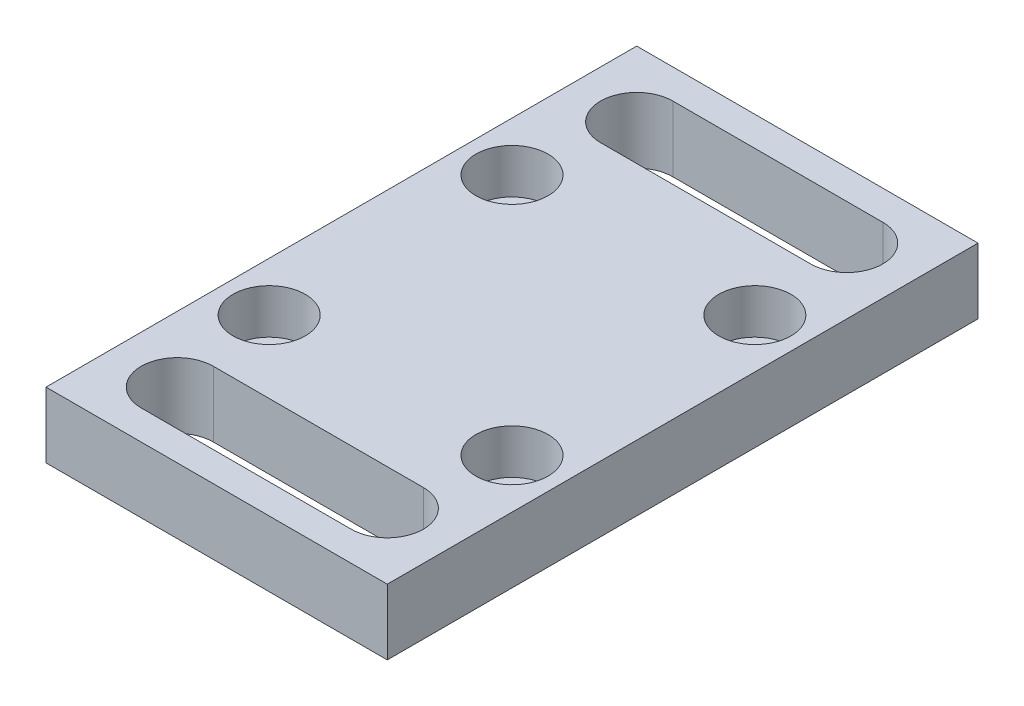
ISO-10303-21;
HEADER;
FILE_DESCRIPTION(('STEP AP214'),'2;1');
FILE_NAME('part.step','',(''),(''),'','','');
FILE_SCHEMA(('AUTOMOTIVE_DESIGN { 1 0 10303 214 1 1 1 1 }'));
ENDSEC;
DATA;
#1=APPLICATION_CONTEXT('core data for automotive mechanical design processes');
#2=APPLICATION_PROTOCOL_DEFINITION('international standard','automotive_design',2000,#1);
#3=PRODUCT_CONTEXT('',#1,'mechanical');
#4=PRODUCT('Part','Part','',(#3));
#5=PRODUCT_RELATED_PRODUCT_CATEGORY('part','',(#4));
#6=PRODUCT_DEFINITION_FORMATION('','',#4);
#7=PRODUCT_DEFINITION_CONTEXT('part definition',#1,'design');
#8=PRODUCT_DEFINITION('design','',#6,#7);
#9=PRODUCT_DEFINITION_SHAPE('','',#8);
#10=(LENGTH_UNIT() NAMED_UNIT(*) SI_UNIT(.MILLI.,.METRE.));
#11=(NAMED_UNIT(*) PLANE_ANGLE_UNIT() SI_UNIT($,.RADIAN.));
#12=(NAMED_UNIT(*) SI_UNIT($,.STERADIAN.) SOLID_ANGLE_UNIT());
#13=UNCERTAINTY_MEASURE_WITH_UNIT(LENGTH_MEASURE(1.E-05),#10,'distance_accuracy_value','');
#14=(GEOMETRIC_REPRESENTATION_CONTEXT(3) GLOBAL_UNCERTAINTY_ASSIGNED_CONTEXT((#13)) GLOBAL_UNIT_ASSIGNED_CONTEXT((#10,
#11,#12)) REPRESENTATION_CONTEXT('',''));
#15=CARTESIAN_POINT('',(0.,0.,0.));
#16=DIRECTION('',(0.,0.,1.));
#17=DIRECTION('',(1.,0.,0.));
#18=AXIS2_PLACEMENT_3D('',#15,#16,#17);
#19=CARTESIAN_POINT('',(26.,10.,45.));
#20=DIRECTION('',(-1.,0.,0.));
#21=DIRECTION('',(0.,0.,1.));
#22=AXIS2_PLACEMENT_3D('',#19,#20,#21);
#23=PLANE('',#22);
#24=DIRECTION('',(0.,0.,-1.));
#25=VECTOR('',#24,1.);
#26=CARTESIAN_POINT('',(26.,0.,45.));
#27=LINE('',#26,#25);
#28=CARTESIAN_POINT('',(26.,0.,45.));
#29=VERTEX_POINT('',#28);
#30=CARTESIAN_POINT('',(26.,0.,-45.));
#31=VERTEX_POINT('',#30);
#32=EDGE_CURVE('E221',#29,#31,#27,.T.);
#33=ORIENTED_EDGE('',*,*,#32,.T.);
#34=DIRECTION('',(0.,-1.,0.));
#35=VECTOR('',#34,1.);
#36=CARTESIAN_POINT('',(26.,10.,-45.));
#37=LINE('',#36,#35);
#38=CARTESIAN_POINT('',(26.,10.,-45.));
#39=VERTEX_POINT('',#38);
#40=EDGE_CURVE('E11',#39,#31,#37,.T.);
#41=ORIENTED_EDGE('',*,*,#40,.F.);
#42=DIRECTION('',(0.,0.,-1.));
#43=VECTOR('',#42,1.);
#44=CARTESIAN_POINT('',(26.,10.,45.));
#45=LINE('',#44,#43);
#46=CARTESIAN_POINT('',(26.,10.,45.));
#47=VERTEX_POINT('',#46);
#48=EDGE_CURVE('E222',#47,#39,#45,.T.);
#49=ORIENTED_EDGE('',*,*,#48,.F.);
#50=DIRECTION('',(0.,-1.,0.));
#51=VECTOR('',#50,1.);
#52=CARTESIAN_POINT('',(26.,10.,45.));
#53=LINE('',#52,#51);
#54=EDGE_CURVE('E232',#47,#29,#53,.T.);
#55=ORIENTED_EDGE('',*,*,#54,.T.);
#56=EDGE_LOOP('',(#33,#41,#49,#55));
#57=FACE_BOUND('',#56,.T.);
#58=ADVANCED_FACE('F17',(#57),#23,.F.);
#59=CARTESIAN_POINT('',(-26.,10.,-45.));
#60=DIRECTION('',(0.,0.,1.));
#61=DIRECTION('',(1.,0.,0.));
#62=AXIS2_PLACEMENT_3D('',#59,#60,#61);
#63=PLANE('',#62);
#64=DIRECTION('',(-1.,0.,0.));
#65=VECTOR('',#64,1.);
#66=CARTESIAN_POINT('',(-26.,0.,-45.));
#67=LINE('',#66,#65);
#68=CARTESIAN_POINT('',(-26.,0.,-45.));
#69=VERTEX_POINT('',#68);
#70=EDGE_CURVE('E235',#31,#69,#67,.T.);
#71=ORIENTED_EDGE('',*,*,#70,.T.);
#72=DIRECTION('',(0.,-1.,0.));
#73=VECTOR('',#72,1.);
#74=CARTESIAN_POINT('',(-26.,10.,-45.));
#75=LINE('',#74,#73);
#76=CARTESIAN_POINT('',(-26.,10.,-45.));
#77=VERTEX_POINT('',#76);
#78=EDGE_CURVE('E24',#77,#69,#75,.T.);
#79=ORIENTED_EDGE('',*,*,#78,.F.);
#80=DIRECTION('',(-1.,0.,0.));
#81=VECTOR('',#80,1.);
#82=CARTESIAN_POINT('',(-26.,10.,-45.));
#83=LINE('',#82,#81);
#84=EDGE_CURVE('E225',#39,#77,#83,.T.);
#85=ORIENTED_EDGE('',*,*,#84,.F.);
#86=ORIENTED_EDGE('',*,*,#40,.T.);
#87=EDGE_LOOP('',(#71,#79,#85,#86));
#88=FACE_BOUND('',#87,.T.);
#89=ADVANCED_FACE('F264',(#88),#63,.F.);
#90=CARTESIAN_POINT('',(-26.,10.,45.));
#91=DIRECTION('',(1.,0.,0.));
#92=DIRECTION('',(0.,0.,-1.));
#93=AXIS2_PLACEMENT_3D('',#90,#91,#92);
#94=PLANE('',#93);
#95=DIRECTION('',(0.,0.,1.));
#96=VECTOR('',#95,1.);
#97=CARTESIAN_POINT('',(-26.,0.,45.));
#98=LINE('',#97,#96);
#99=CARTESIAN_POINT('',(-26.,0.,45.));
#100=VERTEX_POINT('',#99);
#101=EDGE_CURVE('E237',#69,#100,#98,.T.);
#102=ORIENTED_EDGE('',*,*,#101,.T.);
#103=DIRECTION('',(0.,-1.,0.));
#104=VECTOR('',#103,1.);
#105=CARTESIAN_POINT('',(-26.,10.,45.));
#106=LINE('',#105,#104);
#107=CARTESIAN_POINT('',(-26.,10.,45.));
#108=VERTEX_POINT('',#107);
#109=EDGE_CURVE('E242',#108,#100,#106,.T.);
#110=ORIENTED_EDGE('',*,*,#109,.F.);
#111=DIRECTION('',(0.,0.,1.));
#112=VECTOR('',#111,1.);
#113=CARTESIAN_POINT('',(-26.,10.,45.));
#114=LINE('',#113,#112);
#115=EDGE_CURVE('E228',#77,#108,#114,.T.);
#116=ORIENTED_EDGE('',*,*,#115,.F.);
#117=ORIENTED_EDGE('',*,*,#78,.T.);
#118=EDGE_LOOP('',(#102,#110,#116,#117));
#119=FACE_BOUND('',#118,.T.);
#120=ADVANCED_FACE('F249',(#119),#94,.F.);
#121=CARTESIAN_POINT('',(-26.,10.,45.));
#122=DIRECTION('',(0.,0.,-1.));
#123=DIRECTION('',(-1.,0.,0.));
#124=AXIS2_PLACEMENT_3D('',#121,#122,#123);
#125=PLANE('',#124);
#126=DIRECTION('',(1.,0.,0.));
#127=VECTOR('',#126,1.);
#128=CARTESIAN_POINT('',(-26.,0.,45.));
#129=LINE('',#128,#127);
#130=EDGE_CURVE('E226',#100,#29,#129,.T.);
#131=ORIENTED_EDGE('',*,*,#130,.T.);
#132=ORIENTED_EDGE('',*,*,#54,.F.);
#133=DIRECTION('',(1.,0.,0.));
#134=VECTOR('',#133,1.);
#135=CARTESIAN_POINT('',(-26.,10.,45.));
#136=LINE('',#135,#134);
#137=EDGE_CURVE('E230',#108,#47,#136,.T.);
#138=ORIENTED_EDGE('',*,*,#137,.F.);
#139=ORIENTED_EDGE('',*,*,#109,.T.);
#140=EDGE_LOOP('',(#131,#132,#138,#139));
#141=FACE_BOUND('',#140,.T.);
#142=ADVANCED_FACE('F258',(#141),#125,.F.);
#143=CARTESIAN_POINT('',(0.,10.,0.));
#144=DIRECTION('',(0.,-1.,0.));
#145=DIRECTION('',(0.,0.,-1.));
#146=AXIS2_PLACEMENT_3D('',#143,#144,#145);
#147=PLANE('',#146);
#148=DIRECTION('',(1.,0.,0.));
#149=VECTOR('',#148,1.);
#150=CARTESIAN_POINT('',(16.,10.,-40.5));
#151=LINE('',#150,#149);
#152=CARTESIAN_POINT('',(-16.,10.,-40.5));
#153=VERTEX_POINT('',#152);
#154=CARTESIAN_POINT('',(16.,10.,-40.5));
#155=VERTEX_POINT('',#154);
#156=EDGE_CURVE('E113',#153,#155,#151,.T.);
#157=ORIENTED_EDGE('',*,*,#156,.T.);
#158=CARTESIAN_POINT('',(16.,10.,-35.));
#159=DIRECTION('',(0.,-1.,0.));
#160=DIRECTION('',(0.,0.,-1.));
#161=AXIS2_PLACEMENT_3D('',#158,#159,#160);
#162=CIRCLE('',#161,5.5);
#163=CARTESIAN_POINT('',(16.,10.,-29.5));
#164=VERTEX_POINT('',#163);
#165=EDGE_CURVE('E107',#155,#164,#162,.T.);
#166=ORIENTED_EDGE('',*,*,#165,.T.);
#167=DIRECTION('',(-1.,0.,0.));
#168=VECTOR('',#167,1.);
#169=CARTESIAN_POINT('',(16.,10.,-29.5));
#170=LINE('',#169,#168);
#171=CARTESIAN_POINT('',(-16.,10.,-29.5));
#172=VERTEX_POINT('',#171);
#173=EDGE_CURVE('E116',#164,#172,#170,.T.);
#174=ORIENTED_EDGE('',*,*,#173,.T.);
#175=CARTESIAN_POINT('',(-16.,10.,-35.));
#176=DIRECTION('',(0.,-1.,0.));
#177=DIRECTION('',(0.,0.,-1.));
#178=AXIS2_PLACEMENT_3D('',#175,#176,#177);
#179=CIRCLE('',#178,5.5);
#180=EDGE_CURVE('E31',#172,#153,#179,.T.);
#181=ORIENTED_EDGE('',*,*,#180,.T.);
#182=EDGE_LOOP('',(#157,#166,#174,#181));
#183=FACE_BOUND('',#182,.T.);
#184=DIRECTION('',(1.,0.,0.));
#185=VECTOR('',#184,1.);
#186=CARTESIAN_POINT('',(16.,10.,29.5));
#187=LINE('',#186,#185);
#188=CARTESIAN_POINT('',(-16.,10.,29.5));
#189=VERTEX_POINT('',#188);
#190=CARTESIAN_POINT('',(16.,10.,29.5));
#191=VERTEX_POINT('',#190);
#192=EDGE_CURVE('E152',#189,#191,#187,.T.);
#193=ORIENTED_EDGE('',*,*,#192,.T.);
#194=CARTESIAN_POINT('',(16.,10.,35.));
#195=DIRECTION('',(0.,-1.,0.));
#196=DIRECTION('',(0.,0.,-1.));
#197=AXIS2_PLACEMENT_3D('',#194,#195,#196);
#198=CIRCLE('',#197,5.5);
#199=CARTESIAN_POINT('',(16.,10.,40.5));
#200=VERTEX_POINT('',#199);
#201=EDGE_CURVE('E142',#191,#200,#198,.T.);
#202=ORIENTED_EDGE('',*,*,#201,.T.);
#203=DIRECTION('',(-1.,0.,0.));
#204=VECTOR('',#203,1.);
#205=CARTESIAN_POINT('',(16.,10.,40.5));
#206=LINE('',#205,#204);
#207=CARTESIAN_POINT('',(-16.,10.,40.5));
#208=VERTEX_POINT('',#207);
#209=EDGE_CURVE('E145',#200,#208,#206,.T.);
#210=ORIENTED_EDGE('',*,*,#209,.T.);
#211=CARTESIAN_POINT('',(-16.,10.,35.));
#212=DIRECTION('',(0.,-1.,0.));
#213=DIRECTION('',(0.,0.,-1.));
#214=AXIS2_PLACEMENT_3D('',#211,#212,#213);
#215=CIRCLE('',#214,5.5);
#216=EDGE_CURVE('E149',#208,#189,#215,.T.);
#217=ORIENTED_EDGE('',*,*,#216,.T.);
#218=EDGE_LOOP('',(#193,#202,#210,#217));
#219=FACE_BOUND('',#218,.T.);
#220=CARTESIAN_POINT('',(-18.5,10.,-18.5));
#221=DIRECTION('',(0.,1.,0.));
#222=DIRECTION('',(0.,0.,1.));
#223=AXIS2_PLACEMENT_3D('',#220,#221,#222);
#224=CIRCLE('',#223,5.5);
#225=CARTESIAN_POINT('',(-18.5,10.,-13.));
#226=VERTEX_POINT('',#225);
#227=EDGE_CURVE('E167',#226,#226,#224,.T.);
#228=ORIENTED_EDGE('',*,*,#227,.F.);
#229=EDGE_LOOP('',(#228));
#230=FACE_BOUND('',#229,.T.);
#231=CARTESIAN_POINT('',(18.5,10.,-18.5));
#232=DIRECTION('',(0.,1.,0.));
#233=DIRECTION('',(0.,0.,1.));
#234=AXIS2_PLACEMENT_3D('',#231,#232,#233);
#235=CIRCLE('',#234,5.5);
#236=CARTESIAN_POINT('',(18.5,10.,-13.));
#237=VERTEX_POINT('',#236);
#238=EDGE_CURVE('E185',#237,#237,#235,.T.);
#239=ORIENTED_EDGE('',*,*,#238,.F.);
#240=EDGE_LOOP('',(#239));
#241=FACE_BOUND('',#240,.T.);
#242=CARTESIAN_POINT('',(18.5,10.,18.5));
#243=DIRECTION('',(0.,1.,0.));
#244=DIRECTION('',(0.,0.,1.));
#245=AXIS2_PLACEMENT_3D('',#242,#243,#244);
#246=CIRCLE('',#245,5.5);
#247=CARTESIAN_POINT('',(18.5,10.,24.));
#248=VERTEX_POINT('',#247);
#249=EDGE_CURVE('E197',#248,#248,#246,.T.);
#250=ORIENTED_EDGE('',*,*,#249,.F.);
#251=EDGE_LOOP('',(#250));
#252=FACE_BOUND('',#251,.T.);
#253=CARTESIAN_POINT('',(-18.5,10.,18.5));
#254=DIRECTION('',(0.,1.,0.));
#255=DIRECTION('',(0.,0.,1.));
#256=AXIS2_PLACEMENT_3D('',#253,#254,#255);
#257=CIRCLE('',#256,5.5);
#258=CARTESIAN_POINT('',(-18.5,10.,24.));
#259=VERTEX_POINT('',#258);
#260=EDGE_CURVE('E209',#259,#259,#257,.T.);
#261=ORIENTED_EDGE('',*,*,#260,.F.);
#262=EDGE_LOOP('',(#261));
#263=FACE_BOUND('',#262,.T.);
#264=ORIENTED_EDGE('',*,*,#48,.T.);
#265=ORIENTED_EDGE('',*,*,#84,.T.);
#266=ORIENTED_EDGE('',*,*,#115,.T.);
#267=ORIENTED_EDGE('',*,*,#137,.T.);
#268=EDGE_LOOP('',(#264,#265,#266,#267));
#269=FACE_BOUND('',#268,.T.);
#270=ADVANCED_FACE('F120',(#183,#219,#230,#241,#252,#263,#269),#147,.F.);
#271=CARTESIAN_POINT('',(0.,0.,0.));
#272=DIRECTION('',(0.,-1.,0.));
#273=DIRECTION('',(0.,0.,-1.));
#274=AXIS2_PLACEMENT_3D('',#271,#272,#273);
#275=PLANE('',#274);
#276=CARTESIAN_POINT('',(16.,0.,-35.));
#277=DIRECTION('',(0.,-1.,0.));
#278=DIRECTION('',(0.,0.,-1.));
#279=AXIS2_PLACEMENT_3D('',#276,#277,#278);
#280=CIRCLE('',#279,5.5);
#281=CARTESIAN_POINT('',(16.,0.,-40.5));
#282=VERTEX_POINT('',#281);
#283=CARTESIAN_POINT('',(16.,0.,-29.5));
#284=VERTEX_POINT('',#283);
#285=EDGE_CURVE('E39',#282,#284,#280,.T.);
#286=ORIENTED_EDGE('',*,*,#285,.F.);
#287=DIRECTION('',(1.,0.,0.));
#288=VECTOR('',#287,1.);
#289=CARTESIAN_POINT('',(16.,0.,-40.5));
#290=LINE('',#289,#288);
#291=CARTESIAN_POINT('',(-16.,0.,-40.5));
#292=VERTEX_POINT('',#291);
#293=EDGE_CURVE('E123',#292,#282,#290,.T.);
#294=ORIENTED_EDGE('',*,*,#293,.F.);
#295=CARTESIAN_POINT('',(-16.,0.,-35.));
#296=DIRECTION('',(0.,-1.,0.));
#297=DIRECTION('',(0.,0.,-1.));
#298=AXIS2_PLACEMENT_3D('',#295,#296,#297);
#299=CIRCLE('',#298,5.5);
#300=CARTESIAN_POINT('',(-16.,0.,-29.5));
#301=VERTEX_POINT('',#300);
#302=EDGE_CURVE('E126',#301,#292,#299,.T.);
#303=ORIENTED_EDGE('',*,*,#302,.F.);
#304=DIRECTION('',(-1.,0.,0.));
#305=VECTOR('',#304,1.);
#306=CARTESIAN_POINT('',(16.,0.,-29.5));
#307=LINE('',#306,#305);
#308=EDGE_CURVE('E132',#284,#301,#307,.T.);
#309=ORIENTED_EDGE('',*,*,#308,.F.);
#310=EDGE_LOOP('',(#286,#294,#303,#309));
#311=FACE_BOUND('',#310,.T.);
#312=CARTESIAN_POINT('',(16.,0.,35.));
#313=DIRECTION('',(0.,-1.,0.));
#314=DIRECTION('',(0.,0.,-1.));
#315=AXIS2_PLACEMENT_3D('',#312,#313,#314);
#316=CIRCLE('',#315,5.5);
#317=CARTESIAN_POINT('',(16.,0.,29.5));
#318=VERTEX_POINT('',#317);
#319=CARTESIAN_POINT('',(16.,0.,40.5));
#320=VERTEX_POINT('',#319);
#321=EDGE_CURVE('E138',#318,#320,#316,.T.);
#322=ORIENTED_EDGE('',*,*,#321,.F.);
#323=DIRECTION('',(1.,0.,0.));
#324=VECTOR('',#323,1.);
#325=CARTESIAN_POINT('',(16.,0.,29.5));
#326=LINE('',#325,#324);
#327=CARTESIAN_POINT('',(-16.,0.,29.5));
#328=VERTEX_POINT('',#327);
#329=EDGE_CURVE('E146',#328,#318,#326,.T.);
#330=ORIENTED_EDGE('',*,*,#329,.F.);
#331=CARTESIAN_POINT('',(-16.,0.,35.));
#332=DIRECTION('',(0.,-1.,0.));
#333=DIRECTION('',(0.,0.,-1.));
#334=AXIS2_PLACEMENT_3D('',#331,#332,#333);
#335=CIRCLE('',#334,5.5);
#336=CARTESIAN_POINT('',(-16.,0.,40.5));
#337=VERTEX_POINT('',#336);
#338=EDGE_CURVE('E160',#337,#328,#335,.T.);
#339=ORIENTED_EDGE('',*,*,#338,.F.);
#340=DIRECTION('',(-1.,0.,0.));
#341=VECTOR('',#340,1.);
#342=CARTESIAN_POINT('',(16.,0.,40.5));
#343=LINE('',#342,#341);
#344=EDGE_CURVE('E157',#320,#337,#343,.T.);
#345=ORIENTED_EDGE('',*,*,#344,.F.);
#346=EDGE_LOOP('',(#322,#330,#339,#345));
#347=FACE_BOUND('',#346,.T.);
#348=CARTESIAN_POINT('',(-18.5,0.,-18.5));
#349=DIRECTION('',(0.,1.,0.));
#350=DIRECTION('',(0.,0.,1.));
#351=AXIS2_PLACEMENT_3D('',#348,#349,#350);
#352=CIRCLE('',#351,3.5);
#353=CARTESIAN_POINT('',(-18.5,0.,-15.));
#354=VERTEX_POINT('',#353);
#355=EDGE_CURVE('E182',#354,#354,#352,.T.);
#356=ORIENTED_EDGE('',*,*,#355,.T.);
#357=EDGE_LOOP('',(#356));
#358=FACE_BOUND('',#357,.T.);
#359=CARTESIAN_POINT('',(18.5,0.,-18.5));
#360=DIRECTION('',(0.,1.,0.));
#361=DIRECTION('',(0.,0.,1.));
#362=AXIS2_PLACEMENT_3D('',#359,#360,#361);
#363=CIRCLE('',#362,3.5);
#364=CARTESIAN_POINT('',(18.5,0.,-15.));
#365=VERTEX_POINT('',#364);
#366=EDGE_CURVE('E194',#365,#365,#363,.T.);
#367=ORIENTED_EDGE('',*,*,#366,.T.);
#368=EDGE_LOOP('',(#367));
#369=FACE_BOUND('',#368,.T.);
#370=CARTESIAN_POINT('',(18.5,0.,18.5));
#371=DIRECTION('',(0.,1.,0.));
#372=DIRECTION('',(0.,0.,1.));
#373=AXIS2_PLACEMENT_3D('',#370,#371,#372);
#374=CIRCLE('',#373,3.5);
#375=CARTESIAN_POINT('',(18.5,0.,22.));
#376=VERTEX_POINT('',#375);
#377=EDGE_CURVE('E206',#376,#376,#374,.T.);
#378=ORIENTED_EDGE('',*,*,#377,.T.);
#379=EDGE_LOOP('',(#378));
#380=FACE_BOUND('',#379,.T.);
#381=CARTESIAN_POINT('',(-18.5,0.,18.5));
#382=DIRECTION('',(0.,1.,0.));
#383=DIRECTION('',(0.,0.,1.));
#384=AXIS2_PLACEMENT_3D('',#381,#382,#383);
#385=CIRCLE('',#384,3.5);
#386=CARTESIAN_POINT('',(-18.5,0.,22.));
#387=VERTEX_POINT('',#386);
#388=EDGE_CURVE('E218',#387,#387,#385,.T.);
#389=ORIENTED_EDGE('',*,*,#388,.T.);
#390=EDGE_LOOP('',(#389));
#391=FACE_BOUND('',#390,.T.);
#392=ORIENTED_EDGE('',*,*,#32,.F.);
#393=ORIENTED_EDGE('',*,*,#130,.F.);
#394=ORIENTED_EDGE('',*,*,#101,.F.);
#395=ORIENTED_EDGE('',*,*,#70,.F.);
#396=EDGE_LOOP('',(#392,#393,#394,#395));
#397=FACE_BOUND('',#396,.T.);
#398=ADVANCED_FACE('F255',(#311,#347,#358,#369,#380,#391,#397),#275,.T.);
#399=CARTESIAN_POINT('',(-18.5,10.,18.5));
#400=DIRECTION('',(0.,1.,0.));
#401=DIRECTION('',(0.,0.,1.));
#402=AXIS2_PLACEMENT_3D('',#399,#400,#401);
#403=CYLINDRICAL_SURFACE('',#402,3.5);
#404=ORIENTED_EDGE('',*,*,#388,.F.);
#405=EDGE_LOOP('',(#404));
#406=FACE_BOUND('',#405,.T.);
#407=CARTESIAN_POINT('',(-18.5,3.2,18.5));
#408=DIRECTION('',(0.,1.,0.));
#409=DIRECTION('',(0.,0.,1.));
#410=AXIS2_PLACEMENT_3D('',#407,#408,#409);
#411=CIRCLE('',#410,3.5);
#412=CARTESIAN_POINT('',(-18.5,3.2,22.));
#413=VERTEX_POINT('',#412);
#414=EDGE_CURVE('E215',#413,#413,#411,.T.);
#415=ORIENTED_EDGE('',*,*,#414,.T.);
#416=EDGE_LOOP('',(#415));
#417=FACE_BOUND('',#416,.T.);
#418=ADVANCED_FACE('F278',(#406,#417),#403,.F.);
#419=CARTESIAN_POINT('',(-15.,3.2,18.5));
#420=DIRECTION('',(0.,-1.,0.));
#421=DIRECTION('',(0.,0.,-1.));
#422=AXIS2_PLACEMENT_3D('',#419,#420,#421);
#423=PLANE('',#422);
#424=ORIENTED_EDGE('',*,*,#414,.F.);
#425=EDGE_LOOP('',(#424));
#426=FACE_BOUND('',#425,.T.);
#427=CARTESIAN_POINT('',(-18.5,3.2,18.5));
#428=DIRECTION('',(0.,1.,0.));
#429=DIRECTION('',(0.,0.,1.));
#430=AXIS2_PLACEMENT_3D('',#427,#428,#429);
#431=CIRCLE('',#430,5.5);
#432=CARTESIAN_POINT('',(-18.5,3.2,24.));
#433=VERTEX_POINT('',#432);
#434=EDGE_CURVE('E212',#433,#433,#431,.T.);
#435=ORIENTED_EDGE('',*,*,#434,.T.);
#436=EDGE_LOOP('',(#435));
#437=FACE_BOUND('',#436,.T.);
#438=ADVANCED_FACE('F284',(#426,#437),#423,.F.);
#439=CARTESIAN_POINT('',(-18.5,10.,18.5));
#440=DIRECTION('',(0.,1.,0.));
#441=DIRECTION('',(0.,0.,1.));
#442=AXIS2_PLACEMENT_3D('',#439,#440,#441);
#443=CYLINDRICAL_SURFACE('',#442,5.5);
#444=ORIENTED_EDGE('',*,*,#434,.F.);
#445=EDGE_LOOP('',(#444));
#446=FACE_BOUND('',#445,.T.);
#447=ORIENTED_EDGE('',*,*,#260,.T.);
#448=EDGE_LOOP('',(#447));
#449=FACE_BOUND('',#448,.T.);
#450=ADVANCED_FACE('F288',(#446,#449),#443,.F.);
#451=CARTESIAN_POINT('',(18.5,10.,18.5));
#452=DIRECTION('',(0.,1.,0.));
#453=DIRECTION('',(0.,0.,1.));
#454=AXIS2_PLACEMENT_3D('',#451,#452,#453);
#455=CYLINDRICAL_SURFACE('',#454,3.5);
#456=ORIENTED_EDGE('',*,*,#377,.F.);
#457=EDGE_LOOP('',(#456));
#458=FACE_BOUND('',#457,.T.);
#459=CARTESIAN_POINT('',(18.5,3.2,18.5));
#460=DIRECTION('',(0.,1.,0.));
#461=DIRECTION('',(0.,0.,1.));
#462=AXIS2_PLACEMENT_3D('',#459,#460,#461);
#463=CIRCLE('',#462,3.5);
#464=CARTESIAN_POINT('',(18.5,3.2,22.));
#465=VERTEX_POINT('',#464);
#466=EDGE_CURVE('E203',#465,#465,#463,.T.);
#467=ORIENTED_EDGE('',*,*,#466,.T.);
#468=EDGE_LOOP('',(#467));
#469=FACE_BOUND('',#468,.T.);
#470=ADVANCED_FACE('F292',(#458,#469),#455,.F.);
#471=CARTESIAN_POINT('',(22.,3.2,18.5));
#472=DIRECTION('',(0.,-1.,0.));
#473=DIRECTION('',(0.,0.,-1.));
#474=AXIS2_PLACEMENT_3D('',#471,#472,#473);
#475=PLANE('',#474);
#476=ORIENTED_EDGE('',*,*,#466,.F.);
#477=EDGE_LOOP('',(#476));
#478=FACE_BOUND('',#477,.T.);
#479=CARTESIAN_POINT('',(18.5,3.2,18.5));
#480=DIRECTION('',(0.,1.,0.));
#481=DIRECTION('',(0.,0.,1.));
#482=AXIS2_PLACEMENT_3D('',#479,#480,#481);
#483=CIRCLE('',#482,5.5);
#484=CARTESIAN_POINT('',(18.5,3.2,24.));
#485=VERTEX_POINT('',#484);
#486=EDGE_CURVE('E200',#485,#485,#483,.T.);
#487=ORIENTED_EDGE('',*,*,#486,.T.);
#488=EDGE_LOOP('',(#487));
#489=FACE_BOUND('',#488,.T.);
#490=ADVANCED_FACE('F296',(#478,#489),#475,.F.);
#491=CARTESIAN_POINT('',(18.5,10.,18.5));
#492=DIRECTION('',(0.,1.,0.));
#493=DIRECTION('',(0.,0.,1.));
#494=AXIS2_PLACEMENT_3D('',#491,#492,#493);
#495=CYLINDRICAL_SURFACE('',#494,5.5);
#496=ORIENTED_EDGE('',*,*,#486,.F.);
#497=EDGE_LOOP('',(#496));
#498=FACE_BOUND('',#497,.T.);
#499=ORIENTED_EDGE('',*,*,#249,.T.);
#500=EDGE_LOOP('',(#499));
#501=FACE_BOUND('',#500,.T.);
#502=ADVANCED_FACE('F300',(#498,#501),#495,.F.);
#503=CARTESIAN_POINT('',(18.5,10.,-18.5));
#504=DIRECTION('',(0.,1.,0.));
#505=DIRECTION('',(0.,0.,1.));
#506=AXIS2_PLACEMENT_3D('',#503,#504,#505);
#507=CYLINDRICAL_SURFACE('',#506,3.5);
#508=ORIENTED_EDGE('',*,*,#366,.F.);
#509=EDGE_LOOP('',(#508));
#510=FACE_BOUND('',#509,.T.);
#511=CARTESIAN_POINT('',(18.5,3.2,-18.5));
#512=DIRECTION('',(0.,1.,0.));
#513=DIRECTION('',(0.,0.,1.));
#514=AXIS2_PLACEMENT_3D('',#511,#512,#513);
#515=CIRCLE('',#514,3.5);
#516=CARTESIAN_POINT('',(18.5,3.2,-15.));
#517=VERTEX_POINT('',#516);
#518=EDGE_CURVE('E191',#517,#517,#515,.T.);
#519=ORIENTED_EDGE('',*,*,#518,.T.);
#520=EDGE_LOOP('',(#519));
#521=FACE_BOUND('',#520,.T.);
#522=ADVANCED_FACE('F304',(#510,#521),#507,.F.);
#523=CARTESIAN_POINT('',(22.,3.2,-18.5));
#524=DIRECTION('',(0.,-1.,0.));
#525=DIRECTION('',(0.,0.,-1.));
#526=AXIS2_PLACEMENT_3D('',#523,#524,#525);
#527=PLANE('',#526);
#528=ORIENTED_EDGE('',*,*,#518,.F.);
#529=EDGE_LOOP('',(#528));
#530=FACE_BOUND('',#529,.T.);
#531=CARTESIAN_POINT('',(18.5,3.2,-18.5));
#532=DIRECTION('',(0.,1.,0.));
#533=DIRECTION('',(0.,0.,1.));
#534=AXIS2_PLACEMENT_3D('',#531,#532,#533);
#535=CIRCLE('',#534,5.5);
#536=CARTESIAN_POINT('',(18.5,3.2,-13.));
#537=VERTEX_POINT('',#536);
#538=EDGE_CURVE('E188',#537,#537,#535,.T.);
#539=ORIENTED_EDGE('',*,*,#538,.T.);
#540=EDGE_LOOP('',(#539));
#541=FACE_BOUND('',#540,.T.);
#542=ADVANCED_FACE('F308',(#530,#541),#527,.F.);
#543=CARTESIAN_POINT('',(18.5,10.,-18.5));
#544=DIRECTION('',(0.,1.,0.));
#545=DIRECTION('',(0.,0.,1.));
#546=AXIS2_PLACEMENT_3D('',#543,#544,#545);
#547=CYLINDRICAL_SURFACE('',#546,5.5);
#548=ORIENTED_EDGE('',*,*,#538,.F.);
#549=EDGE_LOOP('',(#548));
#550=FACE_BOUND('',#549,.T.);
#551=ORIENTED_EDGE('',*,*,#238,.T.);
#552=EDGE_LOOP('',(#551));
#553=FACE_BOUND('',#552,.T.);
#554=ADVANCED_FACE('F312',(#550,#553),#547,.F.);
#555=CARTESIAN_POINT('',(-18.5,10.,-18.5));
#556=DIRECTION('',(0.,1.,0.));
#557=DIRECTION('',(0.,0.,1.));
#558=AXIS2_PLACEMENT_3D('',#555,#556,#557);
#559=CYLINDRICAL_SURFACE('',#558,3.5);
#560=ORIENTED_EDGE('',*,*,#355,.F.);
#561=EDGE_LOOP('',(#560));
#562=FACE_BOUND('',#561,.T.);
#563=CARTESIAN_POINT('',(-18.5,3.2,-18.5));
#564=DIRECTION('',(0.,1.,0.));
#565=DIRECTION('',(0.,0.,1.));
#566=AXIS2_PLACEMENT_3D('',#563,#564,#565);
#567=CIRCLE('',#566,3.5);
#568=CARTESIAN_POINT('',(-18.5,3.2,-15.));
#569=VERTEX_POINT('',#568);
#570=EDGE_CURVE('E179',#569,#569,#567,.T.);
#571=ORIENTED_EDGE('',*,*,#570,.T.);
#572=EDGE_LOOP('',(#571));
#573=FACE_BOUND('',#572,.T.);
#574=ADVANCED_FACE('F316',(#562,#573),#559,.F.);
#575=CARTESIAN_POINT('',(-15.,3.2,-18.5));
#576=DIRECTION('',(0.,-1.,0.));
#577=DIRECTION('',(0.,0.,-1.));
#578=AXIS2_PLACEMENT_3D('',#575,#576,#577);
#579=PLANE('',#578);
#580=ORIENTED_EDGE('',*,*,#570,.F.);
#581=EDGE_LOOP('',(#580));
#582=FACE_BOUND('',#581,.T.);
#583=CARTESIAN_POINT('',(-18.5,3.2,-18.5));
#584=DIRECTION('',(0.,1.,0.));
#585=DIRECTION('',(0.,0.,1.));
#586=AXIS2_PLACEMENT_3D('',#583,#584,#585);
#587=CIRCLE('',#586,5.5);
#588=CARTESIAN_POINT('',(-18.5,3.2,-13.));
#589=VERTEX_POINT('',#588);
#590=EDGE_CURVE('E176',#589,#589,#587,.T.);
#591=ORIENTED_EDGE('',*,*,#590,.T.);
#592=EDGE_LOOP('',(#591));
#593=FACE_BOUND('',#592,.T.);
#594=ADVANCED_FACE('F320',(#582,#593),#579,.F.);
#595=CARTESIAN_POINT('',(-18.5,10.,-18.5));
#596=DIRECTION('',(0.,1.,0.));
#597=DIRECTION('',(0.,0.,1.));
#598=AXIS2_PLACEMENT_3D('',#595,#596,#597);
#599=CYLINDRICAL_SURFACE('',#598,5.5);
#600=ORIENTED_EDGE('',*,*,#590,.F.);
#601=EDGE_LOOP('',(#600));
#602=FACE_BOUND('',#601,.T.);
#603=ORIENTED_EDGE('',*,*,#227,.T.);
#604=EDGE_LOOP('',(#603));
#605=FACE_BOUND('',#604,.T.);
#606=ADVANCED_FACE('F324',(#602,#605),#599,.F.);
#607=CARTESIAN_POINT('',(16.,10.,35.));
#608=DIRECTION('',(0.,-1.,0.));
#609=DIRECTION('',(0.,0.,-1.));
#610=AXIS2_PLACEMENT_3D('',#607,#608,#609);
#611=CYLINDRICAL_SURFACE('',#610,5.5);
#612=ORIENTED_EDGE('',*,*,#321,.T.);
#613=DIRECTION('',(0.,-1.,0.));
#614=VECTOR('',#613,1.);
#615=CARTESIAN_POINT('',(16.,10.,40.5));
#616=LINE('',#615,#614);
#617=EDGE_CURVE('E155',#200,#320,#616,.T.);
#618=ORIENTED_EDGE('',*,*,#617,.F.);
#619=ORIENTED_EDGE('',*,*,#201,.F.);
#620=DIRECTION('',(0.,-1.,0.));
#621=VECTOR('',#620,1.);
#622=CARTESIAN_POINT('',(16.,10.,29.5));
#623=LINE('',#622,#621);
#624=EDGE_CURVE('E165',#191,#318,#623,.T.);
#625=ORIENTED_EDGE('',*,*,#624,.T.);
#626=EDGE_LOOP('',(#612,#618,#619,#625));
#627=FACE_BOUND('',#626,.T.);
#628=ADVANCED_FACE('F328',(#627),#611,.F.);
#629=CARTESIAN_POINT('',(16.,10.,29.5));
#630=DIRECTION('',(0.,0.,-1.));
#631=DIRECTION('',(-1.,0.,0.));
#632=AXIS2_PLACEMENT_3D('',#629,#630,#631);
#633=PLANE('',#632);
#634=ORIENTED_EDGE('',*,*,#329,.T.);
#635=ORIENTED_EDGE('',*,*,#624,.F.);
#636=ORIENTED_EDGE('',*,*,#192,.F.);
#637=DIRECTION('',(0.,-1.,0.));
#638=VECTOR('',#637,1.);
#639=CARTESIAN_POINT('',(-16.,10.,29.5));
#640=LINE('',#639,#638);
#641=EDGE_CURVE('E168',#189,#328,#640,.T.);
#642=ORIENTED_EDGE('',*,*,#641,.T.);
#643=EDGE_LOOP('',(#634,#635,#636,#642));
#644=FACE_BOUND('',#643,.T.);
#645=ADVANCED_FACE('F332',(#644),#633,.F.);
#646=CARTESIAN_POINT('',(-16.,10.,35.));
#647=DIRECTION('',(0.,-1.,0.));
#648=DIRECTION('',(0.,0.,-1.));
#649=AXIS2_PLACEMENT_3D('',#646,#647,#648);
#650=CYLINDRICAL_SURFACE('',#649,5.5);
#651=ORIENTED_EDGE('',*,*,#338,.T.);
#652=ORIENTED_EDGE('',*,*,#641,.F.);
#653=ORIENTED_EDGE('',*,*,#216,.F.);
#654=DIRECTION('',(0.,-1.,0.));
#655=VECTOR('',#654,1.);
#656=CARTESIAN_POINT('',(-16.,10.,40.5));
#657=LINE('',#656,#655);
#658=EDGE_CURVE('E170',#208,#337,#657,.T.);
#659=ORIENTED_EDGE('',*,*,#658,.T.);
#660=EDGE_LOOP('',(#651,#652,#653,#659));
#661=FACE_BOUND('',#660,.T.);
#662=ADVANCED_FACE('F337',(#661),#650,.F.);
#663=CARTESIAN_POINT('',(16.,10.,40.5));
#664=DIRECTION('',(0.,0.,1.));
#665=DIRECTION('',(1.,0.,0.));
#666=AXIS2_PLACEMENT_3D('',#663,#664,#665);
#667=PLANE('',#666);
#668=ORIENTED_EDGE('',*,*,#344,.T.);
#669=ORIENTED_EDGE('',*,*,#658,.F.);
#670=ORIENTED_EDGE('',*,*,#209,.F.);
#671=ORIENTED_EDGE('',*,*,#617,.T.);
#672=EDGE_LOOP('',(#668,#669,#670,#671));
#673=FACE_BOUND('',#672,.T.);
#674=ADVANCED_FACE('F334',(#673),#667,.F.);
#675=CARTESIAN_POINT('',(16.,10.,-35.));
#676=DIRECTION('',(0.,-1.,0.));
#677=DIRECTION('',(0.,0.,-1.));
#678=AXIS2_PLACEMENT_3D('',#675,#676,#677);
#679=CYLINDRICAL_SURFACE('',#678,5.5);
#680=ORIENTED_EDGE('',*,*,#285,.T.);
#681=DIRECTION('',(0.,-1.,0.));
#682=VECTOR('',#681,1.);
#683=CARTESIAN_POINT('',(16.,10.,-29.5));
#684=LINE('',#683,#682);
#685=EDGE_CURVE('E103',#164,#284,#684,.T.);
#686=ORIENTED_EDGE('',*,*,#685,.F.);
#687=ORIENTED_EDGE('',*,*,#165,.F.);
#688=DIRECTION('',(0.,-1.,0.));
#689=VECTOR('',#688,1.);
#690=CARTESIAN_POINT('',(16.,10.,-40.5));
#691=LINE('',#690,#689);
#692=EDGE_CURVE('E136',#155,#282,#691,.T.);
#693=ORIENTED_EDGE('',*,*,#692,.T.);
#694=EDGE_LOOP('',(#680,#686,#687,#693));
#695=FACE_BOUND('',#694,.T.);
#696=ADVANCED_FACE('F105',(#695),#679,.F.);
#697=CARTESIAN_POINT('',(16.,10.,-40.5));
#698=DIRECTION('',(0.,0.,-1.));
#699=DIRECTION('',(-1.,0.,0.));
#700=AXIS2_PLACEMENT_3D('',#697,#698,#699);
#701=PLANE('',#700);
#702=ORIENTED_EDGE('',*,*,#293,.T.);
#703=ORIENTED_EDGE('',*,*,#692,.F.);
#704=ORIENTED_EDGE('',*,*,#156,.F.);
#705=DIRECTION('',(0.,-1.,0.));
#706=VECTOR('',#705,1.);
#707=CARTESIAN_POINT('',(-16.,10.,-40.5));
#708=LINE('',#707,#706);
#709=EDGE_CURVE('E139',#153,#292,#708,.T.);
#710=ORIENTED_EDGE('',*,*,#709,.T.);
#711=EDGE_LOOP('',(#702,#703,#704,#710));
#712=FACE_BOUND('',#711,.T.);
#713=ADVANCED_FACE('F347',(#712),#701,.F.);
#714=CARTESIAN_POINT('',(-16.,10.,-35.));
#715=DIRECTION('',(0.,-1.,0.));
#716=DIRECTION('',(0.,0.,-1.));
#717=AXIS2_PLACEMENT_3D('',#714,#715,#716);
#718=CYLINDRICAL_SURFACE('',#717,5.5);
#719=ORIENTED_EDGE('',*,*,#302,.T.);
#720=ORIENTED_EDGE('',*,*,#709,.F.);
#721=ORIENTED_EDGE('',*,*,#180,.F.);
#722=DIRECTION('',(0.,-1.,0.));
#723=VECTOR('',#722,1.);
#724=CARTESIAN_POINT('',(-16.,10.,-29.5));
#725=LINE('',#724,#723);
#726=EDGE_CURVE('E112',#172,#301,#725,.T.);
#727=ORIENTED_EDGE('',*,*,#726,.T.);
#728=EDGE_LOOP('',(#719,#720,#721,#727));
#729=FACE_BOUND('',#728,.T.);
#730=ADVANCED_FACE('F350',(#729),#718,.F.);
#731=CARTESIAN_POINT('',(16.,10.,-29.5));
#732=DIRECTION('',(0.,0.,1.));
#733=DIRECTION('',(1.,0.,0.));
#734=AXIS2_PLACEMENT_3D('',#731,#732,#733);
#735=PLANE('',#734);
#736=ORIENTED_EDGE('',*,*,#308,.T.);
#737=ORIENTED_EDGE('',*,*,#726,.F.);
#738=ORIENTED_EDGE('',*,*,#173,.F.);
#739=ORIENTED_EDGE('',*,*,#685,.T.);
#740=EDGE_LOOP('',(#736,#737,#738,#739));
#741=FACE_BOUND('',#740,.T.);
#742=ADVANCED_FACE('F117',(#741),#735,.F.);
#743=CLOSED_SHELL('',(#58,#89,#120,#142,#270,#398,#418,#438,#450,#470,#490,#502,#522,#542,#554,
#574,#594,#606,#628,#645,#662,#674,#696,#713,#730,#742));
#744=MANIFOLD_SOLID_BREP('B1',#743);
#745=ADVANCED_BREP_SHAPE_REPRESENTATION('',(#18,#744),#14);
#746=SHAPE_DEFINITION_REPRESENTATION(#9,#745);
ENDSEC;
END-ISO-10303-21;
